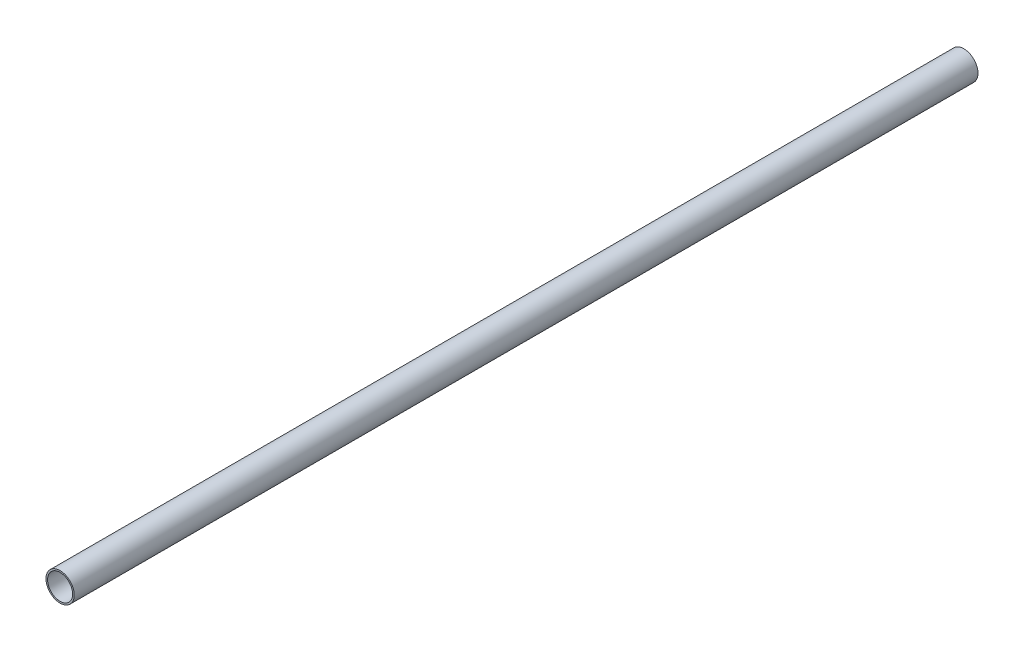
ISO-10303-21;
HEADER;
FILE_DESCRIPTION(('STEP AP214'),'2;1');
FILE_NAME('part.step','',(''),(''),'','','');
FILE_SCHEMA(('AUTOMOTIVE_DESIGN { 1 0 10303 214 1 1 1 1 }'));
ENDSEC;
DATA;
#1=APPLICATION_CONTEXT('core data for automotive mechanical design processes');
#2=APPLICATION_PROTOCOL_DEFINITION('international standard','automotive_design',2000,#1);
#3=PRODUCT_CONTEXT('',#1,'mechanical');
#4=PRODUCT('Part','Part','',(#3));
#5=PRODUCT_RELATED_PRODUCT_CATEGORY('part','',(#4));
#6=PRODUCT_DEFINITION_FORMATION('','',#4);
#7=PRODUCT_DEFINITION_CONTEXT('part definition',#1,'design');
#8=PRODUCT_DEFINITION('design','',#6,#7);
#9=PRODUCT_DEFINITION_SHAPE('','',#8);
#10=(LENGTH_UNIT() NAMED_UNIT(*) SI_UNIT(.MILLI.,.METRE.));
#11=(NAMED_UNIT(*) PLANE_ANGLE_UNIT() SI_UNIT($,.RADIAN.));
#12=(NAMED_UNIT(*) SI_UNIT($,.STERADIAN.) SOLID_ANGLE_UNIT());
#13=UNCERTAINTY_MEASURE_WITH_UNIT(LENGTH_MEASURE(1.E-05),#10,'distance_accuracy_value','');
#14=(GEOMETRIC_REPRESENTATION_CONTEXT(3) GLOBAL_UNCERTAINTY_ASSIGNED_CONTEXT((#13)) GLOBAL_UNIT_ASSIGNED_CONTEXT((#10,
#11,#12)) REPRESENTATION_CONTEXT('',''));
#15=CARTESIAN_POINT('',(0.,0.,0.));
#16=DIRECTION('',(0.,0.,1.));
#17=DIRECTION('',(1.,0.,0.));
#18=AXIS2_PLACEMENT_3D('',#15,#16,#17);
#19=CARTESIAN_POINT('',(0.,0.,-254.));
#20=DIRECTION('',(0.,0.,1.));
#21=DIRECTION('',(1.,0.,0.));
#22=AXIS2_PLACEMENT_3D('',#19,#20,#21);
#23=CYLINDRICAL_SURFACE('',#22,7.9375);
#24=CARTESIAN_POINT('',(0.,0.,-254.));
#25=DIRECTION('',(0.,0.,1.));
#26=DIRECTION('',(1.,0.,0.));
#27=AXIS2_PLACEMENT_3D('',#24,#25,#26);
#28=CIRCLE('',#27,7.9375);
#29=CARTESIAN_POINT('',(7.9375,0.,-254.));
#30=VERTEX_POINT('',#29);
#31=EDGE_CURVE('E10',#30,#30,#28,.T.);
#32=ORIENTED_EDGE('',*,*,#31,.T.);
#33=EDGE_LOOP('',(#32));
#34=FACE_BOUND('',#33,.T.);
#35=CARTESIAN_POINT('',(0.,0.,254.));
#36=DIRECTION('',(0.,0.,1.));
#37=DIRECTION('',(1.,0.,0.));
#38=AXIS2_PLACEMENT_3D('',#35,#36,#37);
#39=CIRCLE('',#38,7.9375);
#40=CARTESIAN_POINT('',(7.9375,0.,254.));
#41=VERTEX_POINT('',#40);
#42=EDGE_CURVE('E55',#41,#41,#39,.T.);
#43=ORIENTED_EDGE('',*,*,#42,.F.);
#44=EDGE_LOOP('',(#43));
#45=FACE_BOUND('',#44,.T.);
#46=ADVANCED_FACE('F43',(#34,#45),#23,.T.);
#47=CARTESIAN_POINT('',(0.,0.,-254.));
#48=DIRECTION('',(0.,0.,1.));
#49=DIRECTION('',(1.,0.,0.));
#50=AXIS2_PLACEMENT_3D('',#47,#48,#49);
#51=PLANE('',#50);
#52=CARTESIAN_POINT('',(0.,0.,-254.));
#53=DIRECTION('',(0.,0.,1.));
#54=DIRECTION('',(1.,0.,0.));
#55=AXIS2_PLACEMENT_3D('',#52,#53,#54);
#56=CIRCLE('',#55,7.0485);
#57=CARTESIAN_POINT('',(7.0485,0.,-254.));
#58=VERTEX_POINT('',#57);
#59=EDGE_CURVE('E50',#58,#58,#56,.T.);
#60=ORIENTED_EDGE('',*,*,#59,.T.);
#61=EDGE_LOOP('',(#60));
#62=FACE_BOUND('',#61,.T.);
#63=ORIENTED_EDGE('',*,*,#31,.F.);
#64=EDGE_LOOP('',(#63));
#65=FACE_BOUND('',#64,.T.);
#66=ADVANCED_FACE('F76',(#62,#65),#51,.F.);
#67=CARTESIAN_POINT('',(0.,0.,-254.));
#68=DIRECTION('',(0.,0.,1.));
#69=DIRECTION('',(1.,0.,0.));
#70=AXIS2_PLACEMENT_3D('',#67,#68,#69);
#71=CYLINDRICAL_SURFACE('',#70,7.0485);
#72=ORIENTED_EDGE('',*,*,#59,.F.);
#73=EDGE_LOOP('',(#72));
#74=FACE_BOUND('',#73,.T.);
#75=CARTESIAN_POINT('',(0.,0.,254.));
#76=DIRECTION('',(0.,0.,1.));
#77=DIRECTION('',(1.,0.,0.));
#78=AXIS2_PLACEMENT_3D('',#75,#76,#77);
#79=CIRCLE('',#78,7.0485);
#80=CARTESIAN_POINT('',(7.0485,0.,254.));
#81=VERTEX_POINT('',#80);
#82=EDGE_CURVE('E60',#81,#81,#79,.T.);
#83=ORIENTED_EDGE('',*,*,#82,.T.);
#84=EDGE_LOOP('',(#83));
#85=FACE_BOUND('',#84,.T.);
#86=ADVANCED_FACE('F67',(#74,#85),#71,.F.);
#87=CARTESIAN_POINT('',(0.,0.,254.));
#88=DIRECTION('',(0.,0.,1.));
#89=DIRECTION('',(1.,0.,0.));
#90=AXIS2_PLACEMENT_3D('',#87,#88,#89);
#91=PLANE('',#90);
#92=ORIENTED_EDGE('',*,*,#42,.T.);
#93=EDGE_LOOP('',(#92));
#94=FACE_BOUND('',#93,.T.);
#95=ORIENTED_EDGE('',*,*,#82,.F.);
#96=EDGE_LOOP('',(#95));
#97=FACE_BOUND('',#96,.T.);
#98=ADVANCED_FACE('F69',(#94,#97),#91,.T.);
#99=CLOSED_SHELL('',(#46,#66,#86,#98));
#100=MANIFOLD_SOLID_BREP('B2',#99);
#101=ADVANCED_BREP_SHAPE_REPRESENTATION('',(#18,#100),#14);
#102=SHAPE_DEFINITION_REPRESENTATION(#9,#101);
ENDSEC;
END-ISO-10303-21;
